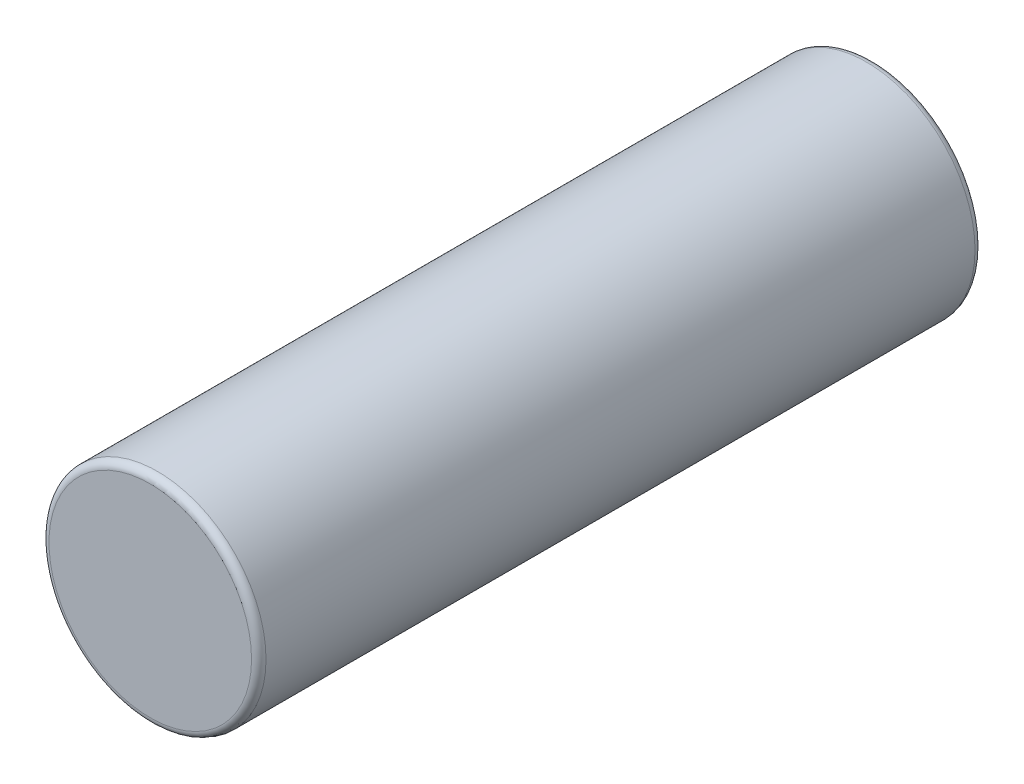
ISO-10303-21;
HEADER;
FILE_DESCRIPTION(('STEP AP214'),'2;1');
FILE_NAME('part.step','',(''),(''),'','','');
FILE_SCHEMA(('AUTOMOTIVE_DESIGN { 1 0 10303 214 1 1 1 1 }'));
ENDSEC;
DATA;
#1=APPLICATION_CONTEXT('core data for automotive mechanical design processes');
#2=APPLICATION_PROTOCOL_DEFINITION('international standard','automotive_design',2000,#1);
#3=PRODUCT_CONTEXT('',#1,'mechanical');
#4=PRODUCT('Part','Part','',(#3));
#5=PRODUCT_RELATED_PRODUCT_CATEGORY('part','',(#4));
#6=PRODUCT_DEFINITION_FORMATION('','',#4);
#7=PRODUCT_DEFINITION_CONTEXT('part definition',#1,'design');
#8=PRODUCT_DEFINITION('design','',#6,#7);
#9=PRODUCT_DEFINITION_SHAPE('','',#8);
#10=(LENGTH_UNIT() NAMED_UNIT(*) SI_UNIT(.MILLI.,.METRE.));
#11=(NAMED_UNIT(*) PLANE_ANGLE_UNIT() SI_UNIT($,.RADIAN.));
#12=(NAMED_UNIT(*) SI_UNIT($,.STERADIAN.) SOLID_ANGLE_UNIT());
#13=UNCERTAINTY_MEASURE_WITH_UNIT(LENGTH_MEASURE(1.E-05),#10,'distance_accuracy_value','');
#14=(GEOMETRIC_REPRESENTATION_CONTEXT(3) GLOBAL_UNCERTAINTY_ASSIGNED_CONTEXT((#13)) GLOBAL_UNIT_ASSIGNED_CONTEXT((#10,
#11,#12)) REPRESENTATION_CONTEXT('',''));
#15=CARTESIAN_POINT('',(0.,0.,0.));
#16=DIRECTION('',(0.,0.,1.));
#17=DIRECTION('',(1.,0.,0.));
#18=AXIS2_PLACEMENT_3D('',#15,#16,#17);
#19=CARTESIAN_POINT('',(0.,0.,10.));
#20=DIRECTION('',(0.,0.,-1.));
#21=DIRECTION('',(-1.,0.,0.));
#22=AXIS2_PLACEMENT_3D('',#19,#20,#21);
#23=CYLINDRICAL_SURFACE('',#22,1.5);
#24=CARTESIAN_POINT('',(0.,0.,0.0999999999999994));
#25=DIRECTION('',(0.,0.,1.));
#26=DIRECTION('',(1.,0.,0.));
#27=AXIS2_PLACEMENT_3D('',#24,#25,#26);
#28=CIRCLE('',#27,1.5);
#29=CARTESIAN_POINT('',(1.5,0.,0.0999999999999994));
#30=VERTEX_POINT('',#29);
#31=EDGE_CURVE('E50',#30,#30,#28,.T.);
#32=ORIENTED_EDGE('',*,*,#31,.T.);
#33=EDGE_LOOP('',(#32));
#34=FACE_BOUND('',#33,.T.);
#35=CARTESIAN_POINT('',(0.,0.,9.9));
#36=DIRECTION('',(0.,0.,1.));
#37=DIRECTION('',(1.,0.,0.));
#38=AXIS2_PLACEMENT_3D('',#35,#36,#37);
#39=CIRCLE('',#38,1.5);
#40=CARTESIAN_POINT('',(1.5,0.,9.9));
#41=VERTEX_POINT('',#40);
#42=EDGE_CURVE('E54',#41,#41,#39,.F.);
#43=ORIENTED_EDGE('',*,*,#42,.T.);
#44=EDGE_LOOP('',(#43));
#45=FACE_BOUND('',#44,.T.);
#46=ADVANCED_FACE('F39',(#34,#45),#23,.T.);
#47=CARTESIAN_POINT('',(0.,0.,10.));
#48=DIRECTION('',(0.,0.,1.));
#49=DIRECTION('',(1.,0.,0.));
#50=AXIS2_PLACEMENT_3D('',#47,#48,#49);
#51=PLANE('',#50);
#52=CARTESIAN_POINT('',(0.,0.,10.));
#53=DIRECTION('',(0.,0.,1.));
#54=DIRECTION('',(1.,0.,0.));
#55=AXIS2_PLACEMENT_3D('',#52,#53,#54);
#56=CIRCLE('',#55,1.4);
#57=CARTESIAN_POINT('',(1.4,0.,10.));
#58=VERTEX_POINT('',#57);
#59=EDGE_CURVE('E10',#58,#58,#56,.T.);
#60=ORIENTED_EDGE('',*,*,#59,.T.);
#61=EDGE_LOOP('',(#60));
#62=FACE_BOUND('',#61,.T.);
#63=ADVANCED_FACE('F70',(#62),#51,.T.);
#64=CARTESIAN_POINT('',(0.,0.,0.));
#65=DIRECTION('',(0.,0.,1.));
#66=DIRECTION('',(1.,0.,0.));
#67=AXIS2_PLACEMENT_3D('',#64,#65,#66);
#68=PLANE('',#67);
#69=CARTESIAN_POINT('',(0.,0.,0.));
#70=DIRECTION('',(0.,0.,1.));
#71=DIRECTION('',(1.,0.,0.));
#72=AXIS2_PLACEMENT_3D('',#69,#70,#71);
#73=CIRCLE('',#72,1.4);
#74=CARTESIAN_POINT('',(1.4,0.,0.));
#75=VERTEX_POINT('',#74);
#76=EDGE_CURVE('E46',#75,#75,#73,.F.);
#77=ORIENTED_EDGE('',*,*,#76,.T.);
#78=EDGE_LOOP('',(#77));
#79=FACE_BOUND('',#78,.T.);
#80=ADVANCED_FACE('F67',(#79),#68,.F.);
#81=CARTESIAN_POINT('',(0.,0.,0.0999999999999994));
#82=DIRECTION('',(0.,0.,1.));
#83=DIRECTION('',(1.,0.,0.));
#84=AXIS2_PLACEMENT_3D('',#81,#82,#83);
#85=TOROIDAL_SURFACE('',#84,1.4,0.1);
#86=ORIENTED_EDGE('',*,*,#76,.F.);
#87=EDGE_LOOP('',(#86));
#88=FACE_BOUND('',#87,.T.);
#89=ORIENTED_EDGE('',*,*,#31,.F.);
#90=EDGE_LOOP('',(#89));
#91=FACE_BOUND('',#90,.T.);
#92=ADVANCED_FACE('F63',(#88,#91),#85,.T.);
#93=CARTESIAN_POINT('',(0.,0.,9.9));
#94=DIRECTION('',(0.,0.,1.));
#95=DIRECTION('',(1.,0.,0.));
#96=AXIS2_PLACEMENT_3D('',#93,#94,#95);
#97=TOROIDAL_SURFACE('',#96,1.4,0.1);
#98=ORIENTED_EDGE('',*,*,#42,.F.);
#99=EDGE_LOOP('',(#98));
#100=FACE_BOUND('',#99,.T.);
#101=ORIENTED_EDGE('',*,*,#59,.F.);
#102=EDGE_LOOP('',(#101));
#103=FACE_BOUND('',#102,.T.);
#104=ADVANCED_FACE('F41',(#100,#103),#97,.T.);
#105=CLOSED_SHELL('',(#46,#63,#80,#92,#104));
#106=MANIFOLD_SOLID_BREP('B2',#105);
#107=ADVANCED_BREP_SHAPE_REPRESENTATION('',(#18,#106),#14);
#108=SHAPE_DEFINITION_REPRESENTATION(#9,#107);
ENDSEC;
END-ISO-10303-21;
